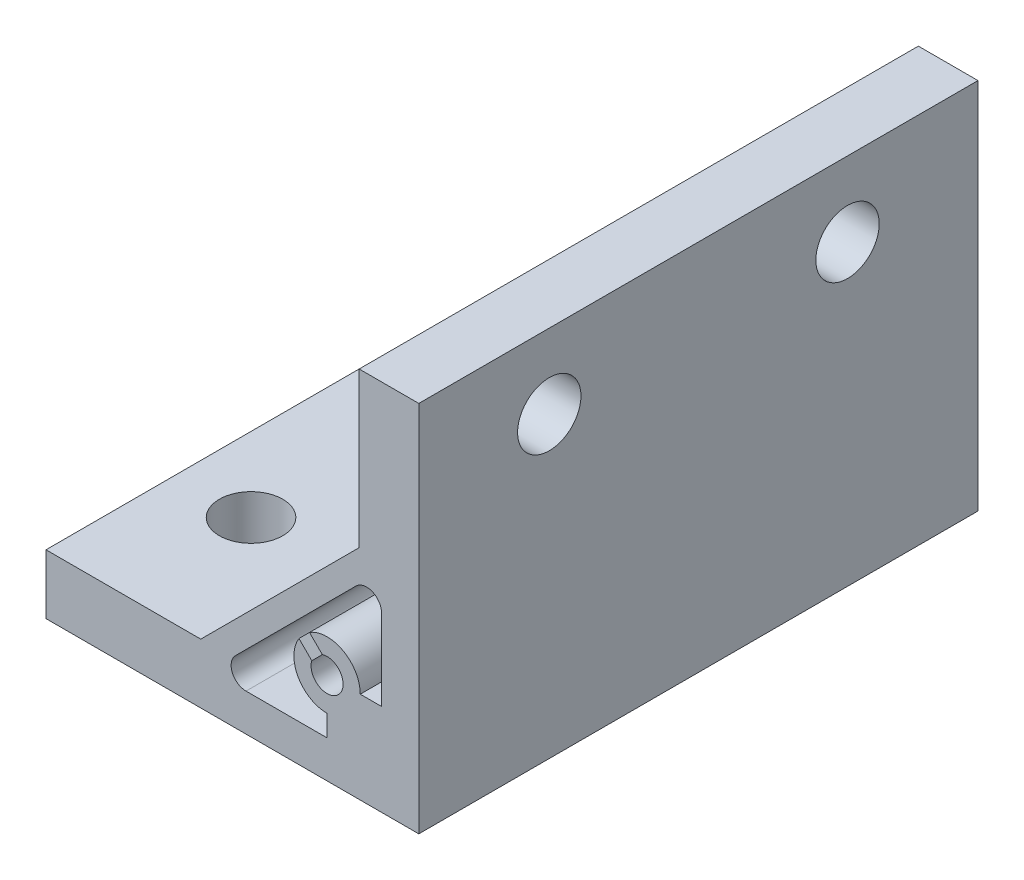
ISO-10303-21;
HEADER;
FILE_DESCRIPTION(('STEP AP214'),'2;1');
FILE_NAME('part.step','',(''),(''),'','','');
FILE_SCHEMA(('AUTOMOTIVE_DESIGN { 1 0 10303 214 1 1 1 1 }'));
ENDSEC;
DATA;
#1=APPLICATION_CONTEXT('core data for automotive mechanical design processes');
#2=APPLICATION_PROTOCOL_DEFINITION('international standard','automotive_design',2000,#1);
#3=PRODUCT_CONTEXT('',#1,'mechanical');
#4=PRODUCT('Part','Part','',(#3));
#5=PRODUCT_RELATED_PRODUCT_CATEGORY('part','',(#4));
#6=PRODUCT_DEFINITION_FORMATION('','',#4);
#7=PRODUCT_DEFINITION_CONTEXT('part definition',#1,'design');
#8=PRODUCT_DEFINITION('design','',#6,#7);
#9=PRODUCT_DEFINITION_SHAPE('','',#8);
#10=(LENGTH_UNIT() NAMED_UNIT(*) SI_UNIT(.MILLI.,.METRE.));
#11=(NAMED_UNIT(*) PLANE_ANGLE_UNIT() SI_UNIT($,.RADIAN.));
#12=(NAMED_UNIT(*) SI_UNIT($,.STERADIAN.) SOLID_ANGLE_UNIT());
#13=UNCERTAINTY_MEASURE_WITH_UNIT(LENGTH_MEASURE(1.E-05),#10,'distance_accuracy_value','');
#14=(GEOMETRIC_REPRESENTATION_CONTEXT(3) GLOBAL_UNCERTAINTY_ASSIGNED_CONTEXT((#13)) GLOBAL_UNIT_ASSIGNED_CONTEXT((#10,
#11,#12)) REPRESENTATION_CONTEXT('',''));
#15=CARTESIAN_POINT('',(0.,0.,0.));
#16=DIRECTION('',(0.,0.,1.));
#17=DIRECTION('',(1.,0.,0.));
#18=AXIS2_PLACEMENT_3D('',#15,#16,#17);
#19=CARTESIAN_POINT('',(50.,0.,37.5));
#20=DIRECTION('',(-1.,0.,0.));
#21=DIRECTION('',(0.,0.,1.));
#22=AXIS2_PLACEMENT_3D('',#19,#20,#21);
#23=PLANE('',#22);
#24=CARTESIAN_POINT('',(50.0000000000001,40.,-20.));
#25=DIRECTION('',(1.,0.,0.));
#26=DIRECTION('',(0.,0.,1.));
#27=AXIS2_PLACEMENT_3D('',#24,#25,#26);
#28=CIRCLE('',#27,4.25);
#29=CARTESIAN_POINT('',(50.0000000000001,40.,-15.75));
#30=VERTEX_POINT('',#29);
#31=EDGE_CURVE('E380',#30,#30,#28,.T.);
#32=ORIENTED_EDGE('',*,*,#31,.F.);
#33=EDGE_LOOP('',(#32));
#34=FACE_BOUND('',#33,.T.);
#35=DIRECTION('',(0.,1.,0.));
#36=VECTOR('',#35,1.);
#37=CARTESIAN_POINT('',(50.,0.,-37.5));
#38=LINE('',#37,#36);
#39=CARTESIAN_POINT('',(50.,0.,-37.5));
#40=VERTEX_POINT('',#39);
#41=CARTESIAN_POINT('',(50.,50.,-37.5));
#42=VERTEX_POINT('',#41);
#43=EDGE_CURVE('E283',#40,#42,#38,.T.);
#44=ORIENTED_EDGE('',*,*,#43,.T.);
#45=DIRECTION('',(0.,0.,-1.));
#46=VECTOR('',#45,1.);
#47=CARTESIAN_POINT('',(50.,50.,37.5));
#48=LINE('',#47,#46);
#49=CARTESIAN_POINT('',(50.,50.,37.5));
#50=VERTEX_POINT('',#49);
#51=EDGE_CURVE('E303',#50,#42,#48,.T.);
#52=ORIENTED_EDGE('',*,*,#51,.F.);
#53=DIRECTION('',(0.,1.,0.));
#54=VECTOR('',#53,1.);
#55=CARTESIAN_POINT('',(50.,0.,37.5));
#56=LINE('',#55,#54);
#57=CARTESIAN_POINT('',(50.,0.,37.5));
#58=VERTEX_POINT('',#57);
#59=EDGE_CURVE('E268',#58,#50,#56,.T.);
#60=ORIENTED_EDGE('',*,*,#59,.F.);
#61=DIRECTION('',(0.,0.,-1.));
#62=VECTOR('',#61,1.);
#63=CARTESIAN_POINT('',(50.,0.,37.5));
#64=LINE('',#63,#62);
#65=EDGE_CURVE('E43',#58,#40,#64,.T.);
#66=ORIENTED_EDGE('',*,*,#65,.T.);
#67=EDGE_LOOP('',(#44,#52,#60,#66));
#68=FACE_BOUND('',#67,.T.);
#69=CARTESIAN_POINT('',(50.0000000000001,40.,20.));
#70=DIRECTION('',(1.,0.,0.));
#71=DIRECTION('',(0.,0.,-1.));
#72=AXIS2_PLACEMENT_3D('',#69,#70,#71);
#73=CIRCLE('',#72,4.25);
#74=CARTESIAN_POINT('',(50.0000000000001,40.,15.75));
#75=VERTEX_POINT('',#74);
#76=EDGE_CURVE('E385',#75,#75,#73,.T.);
#77=ORIENTED_EDGE('',*,*,#76,.F.);
#78=EDGE_LOOP('',(#77));
#79=FACE_BOUND('',#78,.T.);
#80=ADVANCED_FACE('F35',(#34,#68,#79),#23,.F.);
#81=CARTESIAN_POINT('',(42.,29.2426406871192,37.5));
#82=DIRECTION('',(1.,0.,0.));
#83=DIRECTION('',(0.,0.,-1.));
#84=AXIS2_PLACEMENT_3D('',#81,#82,#83);
#85=PLANE('',#84);
#86=CARTESIAN_POINT('',(42.0000000000001,40.,-20.));
#87=DIRECTION('',(1.,0.,0.));
#88=DIRECTION('',(0.,0.,1.));
#89=AXIS2_PLACEMENT_3D('',#86,#87,#88);
#90=CIRCLE('',#89,4.25);
#91=CARTESIAN_POINT('',(42.0000000000001,40.,-15.75));
#92=VERTEX_POINT('',#91);
#93=EDGE_CURVE('E382',#92,#92,#90,.T.);
#94=ORIENTED_EDGE('',*,*,#93,.T.);
#95=EDGE_LOOP('',(#94));
#96=FACE_BOUND('',#95,.T.);
#97=DIRECTION('',(0.,-1.,0.));
#98=VECTOR('',#97,1.);
#99=CARTESIAN_POINT('',(42.,29.2426406871192,-37.5));
#100=LINE('',#99,#98);
#101=CARTESIAN_POINT('',(42.,50.,-37.5));
#102=VERTEX_POINT('',#101);
#103=CARTESIAN_POINT('',(42.,29.2426406871192,-37.5));
#104=VERTEX_POINT('',#103);
#105=EDGE_CURVE('E287',#102,#104,#100,.T.);
#106=ORIENTED_EDGE('',*,*,#105,.T.);
#107=DIRECTION('',(0.,0.,-1.));
#108=VECTOR('',#107,1.);
#109=CARTESIAN_POINT('',(42.,29.2426406871192,37.5));
#110=LINE('',#109,#108);
#111=CARTESIAN_POINT('',(42.,29.2426406871192,37.5));
#112=VERTEX_POINT('',#111);
#113=EDGE_CURVE('E297',#112,#104,#110,.T.);
#114=ORIENTED_EDGE('',*,*,#113,.F.);
#115=DIRECTION('',(0.,-1.,0.));
#116=VECTOR('',#115,1.);
#117=CARTESIAN_POINT('',(42.,29.2426406871192,37.5));
#118=LINE('',#117,#116);
#119=CARTESIAN_POINT('',(42.,50.,37.5));
#120=VERTEX_POINT('',#119);
#121=EDGE_CURVE('E272',#120,#112,#118,.T.);
#122=ORIENTED_EDGE('',*,*,#121,.F.);
#123=DIRECTION('',(0.,0.,-1.));
#124=VECTOR('',#123,1.);
#125=CARTESIAN_POINT('',(42.,50.,37.5));
#126=LINE('',#125,#124);
#127=EDGE_CURVE('E300',#120,#102,#126,.T.);
#128=ORIENTED_EDGE('',*,*,#127,.T.);
#129=EDGE_LOOP('',(#106,#114,#122,#128));
#130=FACE_BOUND('',#129,.T.);
#131=CARTESIAN_POINT('',(42.0000000000001,40.,20.));
#132=DIRECTION('',(1.,0.,0.));
#133=DIRECTION('',(0.,0.,-1.));
#134=AXIS2_PLACEMENT_3D('',#131,#132,#133);
#135=CIRCLE('',#134,4.25);
#136=CARTESIAN_POINT('',(42.0000000000001,40.,15.75));
#137=VERTEX_POINT('',#136);
#138=EDGE_CURVE('E388',#137,#137,#135,.T.);
#139=ORIENTED_EDGE('',*,*,#138,.T.);
#140=EDGE_LOOP('',(#139));
#141=FACE_BOUND('',#140,.T.);
#142=ADVANCED_FACE('F326',(#96,#130,#141),#85,.F.);
#143=CARTESIAN_POINT('',(0.,0.,37.5));
#144=DIRECTION('',(0.,0.,1.));
#145=DIRECTION('',(1.,0.,0.));
#146=AXIS2_PLACEMENT_3D('',#143,#144,#145);
#147=PLANE('',#146);
#148=DIRECTION('',(0.,-1.,0.));
#149=VECTOR('',#148,1.);
#150=CARTESIAN_POINT('',(0.,8.,37.5));
#151=LINE('',#150,#149);
#152=CARTESIAN_POINT('',(0.,8.,37.5));
#153=VERTEX_POINT('',#152);
#154=CARTESIAN_POINT('',(0.,0.,37.5));
#155=VERTEX_POINT('',#154);
#156=EDGE_CURVE('E262',#153,#155,#151,.T.);
#157=ORIENTED_EDGE('',*,*,#156,.T.);
#158=DIRECTION('',(1.,0.,0.));
#159=VECTOR('',#158,1.);
#160=CARTESIAN_POINT('',(0.,0.,37.5));
#161=LINE('',#160,#159);
#162=EDGE_CURVE('E265',#155,#58,#161,.T.);
#163=ORIENTED_EDGE('',*,*,#162,.T.);
#164=ORIENTED_EDGE('',*,*,#59,.T.);
#165=DIRECTION('',(-1.,0.,0.));
#166=VECTOR('',#165,1.);
#167=CARTESIAN_POINT('',(42.,50.,37.5));
#168=LINE('',#167,#166);
#169=EDGE_CURVE('E270',#50,#120,#168,.T.);
#170=ORIENTED_EDGE('',*,*,#169,.T.);
#171=ORIENTED_EDGE('',*,*,#121,.T.);
#172=DIRECTION('',(-0.707106781186546,-0.707106781186549,0.));
#173=VECTOR('',#172,1.);
#174=CARTESIAN_POINT('',(20.7573593128809,8.,37.5));
#175=LINE('',#174,#173);
#176=CARTESIAN_POINT('',(20.7573593128809,8.,37.5));
#177=VERTEX_POINT('',#176);
#178=EDGE_CURVE('E274',#112,#177,#175,.T.);
#179=ORIENTED_EDGE('',*,*,#178,.T.);
#180=DIRECTION('',(-1.,0.,0.));
#181=VECTOR('',#180,1.);
#182=CARTESIAN_POINT('',(0.,8.,37.5));
#183=LINE('',#182,#181);
#184=EDGE_CURVE('E276',#177,#153,#183,.T.);
#185=ORIENTED_EDGE('',*,*,#184,.T.);
#186=EDGE_LOOP('',(#157,#163,#164,#170,#171,#179,#185));
#187=FACE_BOUND('',#186,.T.);
#188=DIRECTION('',(0.707106781186549,-0.707106781186546,0.));
#189=VECTOR('',#188,1.);
#190=CARTESIAN_POINT('',(35.647066335444,12.9387201021829,37.5));
#191=LINE('',#190,#189);
#192=CARTESIAN_POINT('',(33.9267474297161,14.6590390079109,37.5));
#193=VERTEX_POINT('',#192);
#194=CARTESIAN_POINT('',(35.647066335444,12.9387201021829,37.5));
#195=VERTEX_POINT('',#194);
#196=EDGE_CURVE('E174',#193,#195,#191,.T.);
#197=ORIENTED_EDGE('',*,*,#196,.F.);
#198=CARTESIAN_POINT('',(37.7,12.3,37.5));
#199=DIRECTION('',(0.,0.,-1.));
#200=DIRECTION('',(1.,0.,0.));
#201=AXIS2_PLACEMENT_3D('',#198,#199,#200);
#202=CIRCLE('',#201,4.45);
#203=CARTESIAN_POINT('',(37.7,7.84999999999995,37.5));
#204=VERTEX_POINT('',#203);
#205=EDGE_CURVE('E166',#204,#193,#202,.T.);
#206=ORIENTED_EDGE('',*,*,#205,.F.);
#207=DIRECTION('',(0.,1.,0.));
#208=VECTOR('',#207,1.);
#209=CARTESIAN_POINT('',(37.7,5.,37.5));
#210=LINE('',#209,#208);
#211=CARTESIAN_POINT('',(37.7,5.,37.5));
#212=VERTEX_POINT('',#211);
#213=EDGE_CURVE('E209',#212,#204,#210,.T.);
#214=ORIENTED_EDGE('',*,*,#213,.F.);
#215=DIRECTION('',(1.,0.,0.));
#216=VECTOR('',#215,1.);
#217=CARTESIAN_POINT('',(26.828427124746,5.,37.5));
#218=LINE('',#217,#216);
#219=CARTESIAN_POINT('',(26.828427124746,4.99999999999993,37.5));
#220=VERTEX_POINT('',#219);
#221=EDGE_CURVE('E207',#220,#212,#218,.T.);
#222=ORIENTED_EDGE('',*,*,#221,.F.);
#223=CARTESIAN_POINT('',(26.8284271247464,7.00000000000011,37.5));
#224=DIRECTION('',(0.,0.,1.));
#225=DIRECTION('',(1.,0.,0.));
#226=AXIS2_PLACEMENT_3D('',#223,#224,#225);
#227=CIRCLE('',#226,2.00000000000019);
#228=CARTESIAN_POINT('',(25.4142135623729,8.41421356237311,37.5));
#229=VERTEX_POINT('',#228);
#230=EDGE_CURVE('E205',#229,#220,#227,.T.);
#231=ORIENTED_EDGE('',*,*,#230,.F.);
#232=DIRECTION('',(-0.70710678118655,-0.707106781186545,0.));
#233=VECTOR('',#232,1.);
#234=CARTESIAN_POINT('',(25.4142135623729,8.41421356237311,37.5));
#235=LINE('',#234,#233);
#236=CARTESIAN_POINT('',(41.585786437627,24.5857864376269,37.5));
#237=VERTEX_POINT('',#236);
#238=EDGE_CURVE('E203',#237,#229,#235,.T.);
#239=ORIENTED_EDGE('',*,*,#238,.F.);
#240=CARTESIAN_POINT('',(43.0000000000002,23.171572875254,37.5));
#241=DIRECTION('',(0.,0.,1.));
#242=DIRECTION('',(1.,0.,0.));
#243=AXIS2_PLACEMENT_3D('',#240,#241,#242);
#244=CIRCLE('',#243,1.99999999999993);
#245=CARTESIAN_POINT('',(45.,23.1715728752539,37.5));
#246=VERTEX_POINT('',#245);
#247=EDGE_CURVE('E201',#246,#237,#244,.T.);
#248=ORIENTED_EDGE('',*,*,#247,.F.);
#249=DIRECTION('',(0.,1.,0.));
#250=VECTOR('',#249,1.);
#251=CARTESIAN_POINT('',(45.,23.1715728752539,37.5));
#252=LINE('',#251,#250);
#253=CARTESIAN_POINT('',(45.,12.3,37.5));
#254=VERTEX_POINT('',#253);
#255=EDGE_CURVE('E199',#254,#246,#252,.T.);
#256=ORIENTED_EDGE('',*,*,#255,.F.);
#257=DIRECTION('',(1.,0.,0.));
#258=VECTOR('',#257,1.);
#259=CARTESIAN_POINT('',(42.15,12.3,37.5));
#260=LINE('',#259,#258);
#261=CARTESIAN_POINT('',(42.15,12.3,37.5));
#262=VERTEX_POINT('',#261);
#263=EDGE_CURVE('E197',#262,#254,#260,.T.);
#264=ORIENTED_EDGE('',*,*,#263,.F.);
#265=CARTESIAN_POINT('',(37.7,12.3,37.5));
#266=DIRECTION('',(0.,0.,-1.));
#267=DIRECTION('',(1.,0.,0.));
#268=AXIS2_PLACEMENT_3D('',#265,#266,#267);
#269=CIRCLE('',#268,4.45);
#270=CARTESIAN_POINT('',(35.3409609920885,16.0732525702836,37.5));
#271=VERTEX_POINT('',#270);
#272=EDGE_CURVE('E195',#271,#262,#269,.T.);
#273=ORIENTED_EDGE('',*,*,#272,.F.);
#274=DIRECTION('',(-0.707106781186684,0.707106781186411,0.));
#275=VECTOR('',#274,1.);
#276=CARTESIAN_POINT('',(37.0612798978168,14.3529336645559,37.5));
#277=LINE('',#276,#275);
#278=CARTESIAN_POINT('',(37.0612798978168,14.3529336645559,37.5));
#279=VERTEX_POINT('',#278);
#280=EDGE_CURVE('E190',#279,#271,#277,.T.);
#281=ORIENTED_EDGE('',*,*,#280,.F.);
#282=CARTESIAN_POINT('',(37.7,12.3,37.5));
#283=DIRECTION('',(0.,0.,1.));
#284=DIRECTION('',(1.,0.,0.));
#285=AXIS2_PLACEMENT_3D('',#282,#283,#284);
#286=CIRCLE('',#285,2.15);
#287=EDGE_CURVE('E188',#195,#279,#286,.T.);
#288=ORIENTED_EDGE('',*,*,#287,.F.);
#289=EDGE_LOOP('',(#197,#206,#214,#222,#231,#239,#248,#256,#264,#273,#281,#288));
#290=FACE_BOUND('',#289,.T.);
#291=ADVANCED_FACE('F186',(#187,#290),#147,.T.);
#292=CARTESIAN_POINT('',(0.,0.,-37.5));
#293=DIRECTION('',(0.,0.,1.));
#294=DIRECTION('',(1.,0.,0.));
#295=AXIS2_PLACEMENT_3D('',#292,#293,#294);
#296=PLANE('',#295);
#297=DIRECTION('',(0.,-1.,0.));
#298=VECTOR('',#297,1.);
#299=CARTESIAN_POINT('',(0.,8.,-37.5));
#300=LINE('',#299,#298);
#301=CARTESIAN_POINT('',(0.,8.,-37.5));
#302=VERTEX_POINT('',#301);
#303=CARTESIAN_POINT('',(0.,0.,-37.5));
#304=VERTEX_POINT('',#303);
#305=EDGE_CURVE('E182',#302,#304,#300,.T.);
#306=ORIENTED_EDGE('',*,*,#305,.F.);
#307=DIRECTION('',(-1.,0.,0.));
#308=VECTOR('',#307,1.);
#309=CARTESIAN_POINT('',(0.,8.,-37.5));
#310=LINE('',#309,#308);
#311=CARTESIAN_POINT('',(20.7573593128809,8.,-37.5));
#312=VERTEX_POINT('',#311);
#313=EDGE_CURVE('E266',#312,#302,#310,.T.);
#314=ORIENTED_EDGE('',*,*,#313,.F.);
#315=DIRECTION('',(-0.707106781186546,-0.707106781186549,0.));
#316=VECTOR('',#315,1.);
#317=CARTESIAN_POINT('',(20.7573593128809,8.,-37.5));
#318=LINE('',#317,#316);
#319=EDGE_CURVE('E289',#104,#312,#318,.T.);
#320=ORIENTED_EDGE('',*,*,#319,.F.);
#321=ORIENTED_EDGE('',*,*,#105,.F.);
#322=DIRECTION('',(-1.,0.,0.));
#323=VECTOR('',#322,1.);
#324=CARTESIAN_POINT('',(42.,50.,-37.5));
#325=LINE('',#324,#323);
#326=EDGE_CURVE('E285',#42,#102,#325,.T.);
#327=ORIENTED_EDGE('',*,*,#326,.F.);
#328=ORIENTED_EDGE('',*,*,#43,.F.);
#329=DIRECTION('',(1.,0.,0.));
#330=VECTOR('',#329,1.);
#331=CARTESIAN_POINT('',(0.,0.,-37.5));
#332=LINE('',#331,#330);
#333=EDGE_CURVE('E281',#304,#40,#332,.T.);
#334=ORIENTED_EDGE('',*,*,#333,.F.);
#335=EDGE_LOOP('',(#306,#314,#320,#321,#327,#328,#334));
#336=FACE_BOUND('',#335,.T.);
#337=CARTESIAN_POINT('',(37.7,12.3,-37.5));
#338=DIRECTION('',(0.,0.,-1.));
#339=DIRECTION('',(1.,0.,0.));
#340=AXIS2_PLACEMENT_3D('',#337,#338,#339);
#341=CIRCLE('',#340,4.45);
#342=CARTESIAN_POINT('',(37.7,7.84999999999995,-37.5));
#343=VERTEX_POINT('',#342);
#344=CARTESIAN_POINT('',(33.9267474297161,14.6590390079109,-37.5));
#345=VERTEX_POINT('',#344);
#346=EDGE_CURVE('E58',#343,#345,#341,.T.);
#347=ORIENTED_EDGE('',*,*,#346,.T.);
#348=DIRECTION('',(0.707106781186549,-0.707106781186546,0.));
#349=VECTOR('',#348,1.);
#350=CARTESIAN_POINT('',(35.647066335444,12.9387201021829,-37.5));
#351=LINE('',#350,#349);
#352=CARTESIAN_POINT('',(35.647066335444,12.9387201021829,-37.5));
#353=VERTEX_POINT('',#352);
#354=EDGE_CURVE('E181',#345,#353,#351,.T.);
#355=ORIENTED_EDGE('',*,*,#354,.T.);
#356=CARTESIAN_POINT('',(37.7,12.3,-37.5));
#357=DIRECTION('',(0.,0.,1.));
#358=DIRECTION('',(1.,0.,0.));
#359=AXIS2_PLACEMENT_3D('',#356,#357,#358);
#360=CIRCLE('',#359,2.15);
#361=CARTESIAN_POINT('',(37.0612798978168,14.3529336645559,-37.5));
#362=VERTEX_POINT('',#361);
#363=EDGE_CURVE('E214',#353,#362,#360,.T.);
#364=ORIENTED_EDGE('',*,*,#363,.T.);
#365=DIRECTION('',(-0.707106781186684,0.707106781186411,0.));
#366=VECTOR('',#365,1.);
#367=CARTESIAN_POINT('',(37.0612798978168,14.3529336645559,-37.5));
#368=LINE('',#367,#366);
#369=CARTESIAN_POINT('',(35.3409609920885,16.0732525702836,-37.5));
#370=VERTEX_POINT('',#369);
#371=EDGE_CURVE('E217',#362,#370,#368,.T.);
#372=ORIENTED_EDGE('',*,*,#371,.T.);
#373=CARTESIAN_POINT('',(37.7,12.3,-37.5));
#374=DIRECTION('',(0.,0.,-1.));
#375=DIRECTION('',(1.,0.,0.));
#376=AXIS2_PLACEMENT_3D('',#373,#374,#375);
#377=CIRCLE('',#376,4.45);
#378=CARTESIAN_POINT('',(42.15,12.3,-37.5));
#379=VERTEX_POINT('',#378);
#380=EDGE_CURVE('E220',#370,#379,#377,.T.);
#381=ORIENTED_EDGE('',*,*,#380,.T.);
#382=DIRECTION('',(1.,0.,0.));
#383=VECTOR('',#382,1.);
#384=CARTESIAN_POINT('',(42.15,12.3,-37.5));
#385=LINE('',#384,#383);
#386=CARTESIAN_POINT('',(45.,12.3,-37.5));
#387=VERTEX_POINT('',#386);
#388=EDGE_CURVE('E223',#379,#387,#385,.T.);
#389=ORIENTED_EDGE('',*,*,#388,.T.);
#390=DIRECTION('',(0.,1.,0.));
#391=VECTOR('',#390,1.);
#392=CARTESIAN_POINT('',(45.,23.1715728752539,-37.5));
#393=LINE('',#392,#391);
#394=CARTESIAN_POINT('',(45.,23.1715728752539,-37.5));
#395=VERTEX_POINT('',#394);
#396=EDGE_CURVE('E226',#387,#395,#393,.T.);
#397=ORIENTED_EDGE('',*,*,#396,.T.);
#398=CARTESIAN_POINT('',(43.0000000000002,23.171572875254,-37.5));
#399=DIRECTION('',(0.,0.,1.));
#400=DIRECTION('',(1.,0.,0.));
#401=AXIS2_PLACEMENT_3D('',#398,#399,#400);
#402=CIRCLE('',#401,1.99999999999993);
#403=CARTESIAN_POINT('',(41.585786437627,24.5857864376269,-37.5));
#404=VERTEX_POINT('',#403);
#405=EDGE_CURVE('E229',#395,#404,#402,.T.);
#406=ORIENTED_EDGE('',*,*,#405,.T.);
#407=DIRECTION('',(-0.70710678118655,-0.707106781186545,0.));
#408=VECTOR('',#407,1.);
#409=CARTESIAN_POINT('',(25.4142135623729,8.41421356237311,-37.5));
#410=LINE('',#409,#408);
#411=CARTESIAN_POINT('',(25.4142135623729,8.41421356237311,-37.5));
#412=VERTEX_POINT('',#411);
#413=EDGE_CURVE('E232',#404,#412,#410,.T.);
#414=ORIENTED_EDGE('',*,*,#413,.T.);
#415=CARTESIAN_POINT('',(26.8284271247464,7.00000000000011,-37.5));
#416=DIRECTION('',(0.,0.,1.));
#417=DIRECTION('',(1.,0.,0.));
#418=AXIS2_PLACEMENT_3D('',#415,#416,#417);
#419=CIRCLE('',#418,2.00000000000019);
#420=CARTESIAN_POINT('',(26.828427124746,4.99999999999993,-37.5));
#421=VERTEX_POINT('',#420);
#422=EDGE_CURVE('E235',#412,#421,#419,.T.);
#423=ORIENTED_EDGE('',*,*,#422,.T.);
#424=DIRECTION('',(1.,0.,0.));
#425=VECTOR('',#424,1.);
#426=CARTESIAN_POINT('',(26.828427124746,5.,-37.5));
#427=LINE('',#426,#425);
#428=CARTESIAN_POINT('',(37.7,5.,-37.5));
#429=VERTEX_POINT('',#428);
#430=EDGE_CURVE('E238',#421,#429,#427,.T.);
#431=ORIENTED_EDGE('',*,*,#430,.T.);
#432=DIRECTION('',(0.,1.,0.));
#433=VECTOR('',#432,1.);
#434=CARTESIAN_POINT('',(37.7,5.,-37.5));
#435=LINE('',#434,#433);
#436=EDGE_CURVE('E175',#429,#343,#435,.T.);
#437=ORIENTED_EDGE('',*,*,#436,.T.);
#438=EDGE_LOOP('',(#347,#355,#364,#372,#381,#389,#397,#406,#414,#423,#431,#437));
#439=FACE_BOUND('',#438,.T.);
#440=ADVANCED_FACE('F316',(#336,#439),#296,.F.);
#441=CARTESIAN_POINT('',(0.,8.,37.5));
#442=DIRECTION('',(1.,0.,0.));
#443=DIRECTION('',(0.,0.,-1.));
#444=AXIS2_PLACEMENT_3D('',#441,#442,#443);
#445=PLANE('',#444);
#446=ORIENTED_EDGE('',*,*,#305,.T.);
#447=DIRECTION('',(0.,0.,-1.));
#448=VECTOR('',#447,1.);
#449=CARTESIAN_POINT('',(0.,0.,37.5));
#450=LINE('',#449,#448);
#451=EDGE_CURVE('E11',#155,#304,#450,.T.);
#452=ORIENTED_EDGE('',*,*,#451,.F.);
#453=ORIENTED_EDGE('',*,*,#156,.F.);
#454=DIRECTION('',(0.,0.,-1.));
#455=VECTOR('',#454,1.);
#456=CARTESIAN_POINT('',(0.,8.,37.5));
#457=LINE('',#456,#455);
#458=EDGE_CURVE('E278',#153,#302,#457,.T.);
#459=ORIENTED_EDGE('',*,*,#458,.T.);
#460=EDGE_LOOP('',(#446,#452,#453,#459));
#461=FACE_BOUND('',#460,.T.);
#462=ADVANCED_FACE('F37',(#461),#445,.F.);
#463=CARTESIAN_POINT('',(0.,0.,37.5));
#464=DIRECTION('',(0.,1.,0.));
#465=DIRECTION('',(0.,0.,1.));
#466=AXIS2_PLACEMENT_3D('',#463,#464,#465);
#467=PLANE('',#466);
#468=CARTESIAN_POINT('',(10.,0.,20.));
#469=DIRECTION('',(0.,1.,0.));
#470=DIRECTION('',(0.,0.,-1.));
#471=AXIS2_PLACEMENT_3D('',#468,#469,#470);
#472=CIRCLE('',#471,4.25);
#473=CARTESIAN_POINT('',(10.,0.,15.75));
#474=VERTEX_POINT('',#473);
#475=EDGE_CURVE('E369',#474,#474,#472,.T.);
#476=ORIENTED_EDGE('',*,*,#475,.T.);
#477=EDGE_LOOP('',(#476));
#478=FACE_BOUND('',#477,.T.);
#479=CARTESIAN_POINT('',(10.,0.,-20.));
#480=DIRECTION('',(0.,1.,0.));
#481=DIRECTION('',(0.,0.,1.));
#482=AXIS2_PLACEMENT_3D('',#479,#480,#481);
#483=CIRCLE('',#482,4.25);
#484=CARTESIAN_POINT('',(10.,0.,-15.75));
#485=VERTEX_POINT('',#484);
#486=EDGE_CURVE('E212',#485,#485,#483,.T.);
#487=ORIENTED_EDGE('',*,*,#486,.T.);
#488=EDGE_LOOP('',(#487));
#489=FACE_BOUND('',#488,.T.);
#490=ORIENTED_EDGE('',*,*,#333,.T.);
#491=ORIENTED_EDGE('',*,*,#65,.F.);
#492=ORIENTED_EDGE('',*,*,#162,.F.);
#493=ORIENTED_EDGE('',*,*,#451,.T.);
#494=EDGE_LOOP('',(#490,#491,#492,#493));
#495=FACE_BOUND('',#494,.T.);
#496=ADVANCED_FACE('F334',(#478,#489,#495),#467,.F.);
#497=CARTESIAN_POINT('',(42.,50.,37.5));
#498=DIRECTION('',(0.,-1.,0.));
#499=DIRECTION('',(0.,0.,-1.));
#500=AXIS2_PLACEMENT_3D('',#497,#498,#499);
#501=PLANE('',#500);
#502=ORIENTED_EDGE('',*,*,#326,.T.);
#503=ORIENTED_EDGE('',*,*,#127,.F.);
#504=ORIENTED_EDGE('',*,*,#169,.F.);
#505=ORIENTED_EDGE('',*,*,#51,.T.);
#506=EDGE_LOOP('',(#502,#503,#504,#505));
#507=FACE_BOUND('',#506,.T.);
#508=ADVANCED_FACE('F322',(#507),#501,.F.);
#509=CARTESIAN_POINT('',(20.7573593128809,8.,37.5));
#510=DIRECTION('',(0.707106781186549,-0.707106781186546,0.));
#511=DIRECTION('',(0.707106781186546,0.707106781186549,0.));
#512=AXIS2_PLACEMENT_3D('',#509,#510,#511);
#513=PLANE('',#512);
#514=ORIENTED_EDGE('',*,*,#319,.T.);
#515=DIRECTION('',(0.,0.,-1.));
#516=VECTOR('',#515,1.);
#517=CARTESIAN_POINT('',(20.7573593128809,8.,37.5));
#518=LINE('',#517,#516);
#519=EDGE_CURVE('E294',#177,#312,#518,.T.);
#520=ORIENTED_EDGE('',*,*,#519,.F.);
#521=ORIENTED_EDGE('',*,*,#178,.F.);
#522=ORIENTED_EDGE('',*,*,#113,.T.);
#523=EDGE_LOOP('',(#514,#520,#521,#522));
#524=FACE_BOUND('',#523,.T.);
#525=ADVANCED_FACE('F342',(#524),#513,.F.);
#526=CARTESIAN_POINT('',(0.,8.,37.5));
#527=DIRECTION('',(0.,-1.,0.));
#528=DIRECTION('',(0.,0.,-1.));
#529=AXIS2_PLACEMENT_3D('',#526,#527,#528);
#530=PLANE('',#529);
#531=CARTESIAN_POINT('',(10.,8.,20.));
#532=DIRECTION('',(0.,1.,0.));
#533=DIRECTION('',(0.,0.,-1.));
#534=AXIS2_PLACEMENT_3D('',#531,#532,#533);
#535=CIRCLE('',#534,4.25);
#536=CARTESIAN_POINT('',(10.,8.,15.75));
#537=VERTEX_POINT('',#536);
#538=EDGE_CURVE('E377',#537,#537,#535,.T.);
#539=ORIENTED_EDGE('',*,*,#538,.F.);
#540=EDGE_LOOP('',(#539));
#541=FACE_BOUND('',#540,.T.);
#542=CARTESIAN_POINT('',(10.,8.,-20.));
#543=DIRECTION('',(0.,1.,0.));
#544=DIRECTION('',(0.,0.,1.));
#545=AXIS2_PLACEMENT_3D('',#542,#543,#544);
#546=CIRCLE('',#545,4.25);
#547=CARTESIAN_POINT('',(10.,8.,-15.75));
#548=VERTEX_POINT('',#547);
#549=EDGE_CURVE('E373',#548,#548,#546,.T.);
#550=ORIENTED_EDGE('',*,*,#549,.F.);
#551=EDGE_LOOP('',(#550));
#552=FACE_BOUND('',#551,.T.);
#553=ORIENTED_EDGE('',*,*,#313,.T.);
#554=ORIENTED_EDGE('',*,*,#458,.F.);
#555=ORIENTED_EDGE('',*,*,#184,.F.);
#556=ORIENTED_EDGE('',*,*,#519,.T.);
#557=EDGE_LOOP('',(#553,#554,#555,#556));
#558=FACE_BOUND('',#557,.T.);
#559=ADVANCED_FACE('F339',(#541,#552,#558),#530,.F.);
#560=CARTESIAN_POINT('',(37.7,12.3,37.5));
#561=DIRECTION('',(0.,0.,-1.));
#562=DIRECTION('',(-1.,0.,0.));
#563=AXIS2_PLACEMENT_3D('',#560,#561,#562);
#564=CYLINDRICAL_SURFACE('',#563,4.45);
#565=ORIENTED_EDGE('',*,*,#346,.F.);
#566=DIRECTION('',(0.,0.,-1.));
#567=VECTOR('',#566,1.);
#568=CARTESIAN_POINT('',(37.7,7.84999999999995,37.5));
#569=LINE('',#568,#567);
#570=EDGE_CURVE('E170',#204,#343,#569,.T.);
#571=ORIENTED_EDGE('',*,*,#570,.F.);
#572=ORIENTED_EDGE('',*,*,#205,.T.);
#573=DIRECTION('',(0.,0.,-1.));
#574=VECTOR('',#573,1.);
#575=CARTESIAN_POINT('',(33.9267474297161,14.6590390079109,37.5));
#576=LINE('',#575,#574);
#577=EDGE_CURVE('E169',#193,#345,#576,.T.);
#578=ORIENTED_EDGE('',*,*,#577,.T.);
#579=EDGE_LOOP('',(#565,#571,#572,#578));
#580=FACE_BOUND('',#579,.T.);
#581=ADVANCED_FACE('F168',(#580),#564,.T.);
#582=CARTESIAN_POINT('',(35.647066335444,12.9387201021829,37.5));
#583=DIRECTION('',(0.707106781186546,0.707106781186549,0.));
#584=DIRECTION('',(-0.707106781186549,0.707106781186546,0.));
#585=AXIS2_PLACEMENT_3D('',#582,#583,#584);
#586=PLANE('',#585);
#587=ORIENTED_EDGE('',*,*,#354,.F.);
#588=ORIENTED_EDGE('',*,*,#577,.F.);
#589=ORIENTED_EDGE('',*,*,#196,.T.);
#590=DIRECTION('',(0.,0.,-1.));
#591=VECTOR('',#590,1.);
#592=CARTESIAN_POINT('',(35.647066335444,12.9387201021829,37.5));
#593=LINE('',#592,#591);
#594=EDGE_CURVE('E183',#195,#353,#593,.T.);
#595=ORIENTED_EDGE('',*,*,#594,.T.);
#596=EDGE_LOOP('',(#587,#588,#589,#595));
#597=FACE_BOUND('',#596,.T.);
#598=ADVANCED_FACE('F178',(#597),#586,.T.);
#599=CARTESIAN_POINT('',(37.7,12.3,37.5));
#600=DIRECTION('',(0.,0.,-1.));
#601=DIRECTION('',(-1.,0.,0.));
#602=AXIS2_PLACEMENT_3D('',#599,#600,#601);
#603=CYLINDRICAL_SURFACE('',#602,2.15);
#604=ORIENTED_EDGE('',*,*,#363,.F.);
#605=ORIENTED_EDGE('',*,*,#594,.F.);
#606=ORIENTED_EDGE('',*,*,#287,.T.);
#607=DIRECTION('',(0.,0.,-1.));
#608=VECTOR('',#607,1.);
#609=CARTESIAN_POINT('',(37.0612798978168,14.3529336645559,37.5));
#610=LINE('',#609,#608);
#611=EDGE_CURVE('E259',#279,#362,#610,.T.);
#612=ORIENTED_EDGE('',*,*,#611,.T.);
#613=EDGE_LOOP('',(#604,#605,#606,#612));
#614=FACE_BOUND('',#613,.T.);
#615=ADVANCED_FACE('F447',(#614),#603,.F.);
#616=CARTESIAN_POINT('',(37.0612798978168,14.3529336645559,37.5));
#617=DIRECTION('',(-0.707106781186411,-0.707106781186684,0.));
#618=DIRECTION('',(0.707106781186684,-0.707106781186411,0.));
#619=AXIS2_PLACEMENT_3D('',#616,#617,#618);
#620=PLANE('',#619);
#621=ORIENTED_EDGE('',*,*,#371,.F.);
#622=ORIENTED_EDGE('',*,*,#611,.F.);
#623=ORIENTED_EDGE('',*,*,#280,.T.);
#624=DIRECTION('',(0.,0.,-1.));
#625=VECTOR('',#624,1.);
#626=CARTESIAN_POINT('',(35.3409609920885,16.0732525702836,37.5));
#627=LINE('',#626,#625);
#628=EDGE_CURVE('E257',#271,#370,#627,.T.);
#629=ORIENTED_EDGE('',*,*,#628,.T.);
#630=EDGE_LOOP('',(#621,#622,#623,#629));
#631=FACE_BOUND('',#630,.T.);
#632=ADVANCED_FACE('F443',(#631),#620,.T.);
#633=CARTESIAN_POINT('',(37.7,12.3,37.5));
#634=DIRECTION('',(0.,0.,-1.));
#635=DIRECTION('',(-1.,0.,0.));
#636=AXIS2_PLACEMENT_3D('',#633,#634,#635);
#637=CYLINDRICAL_SURFACE('',#636,4.45);
#638=ORIENTED_EDGE('',*,*,#380,.F.);
#639=ORIENTED_EDGE('',*,*,#628,.F.);
#640=ORIENTED_EDGE('',*,*,#272,.T.);
#641=DIRECTION('',(0.,0.,-1.));
#642=VECTOR('',#641,1.);
#643=CARTESIAN_POINT('',(42.15,12.3,37.5));
#644=LINE('',#643,#642);
#645=EDGE_CURVE('E255',#262,#379,#644,.T.);
#646=ORIENTED_EDGE('',*,*,#645,.T.);
#647=EDGE_LOOP('',(#638,#639,#640,#646));
#648=FACE_BOUND('',#647,.T.);
#649=ADVANCED_FACE('F439',(#648),#637,.T.);
#650=CARTESIAN_POINT('',(42.15,12.3,37.5));
#651=DIRECTION('',(0.,1.,0.));
#652=DIRECTION('',(0.,0.,1.));
#653=AXIS2_PLACEMENT_3D('',#650,#651,#652);
#654=PLANE('',#653);
#655=ORIENTED_EDGE('',*,*,#388,.F.);
#656=ORIENTED_EDGE('',*,*,#645,.F.);
#657=ORIENTED_EDGE('',*,*,#263,.T.);
#658=DIRECTION('',(0.,0.,-1.));
#659=VECTOR('',#658,1.);
#660=CARTESIAN_POINT('',(45.,12.3,37.5));
#661=LINE('',#660,#659);
#662=EDGE_CURVE('E253',#254,#387,#661,.T.);
#663=ORIENTED_EDGE('',*,*,#662,.T.);
#664=EDGE_LOOP('',(#655,#656,#657,#663));
#665=FACE_BOUND('',#664,.T.);
#666=ADVANCED_FACE('F435',(#665),#654,.T.);
#667=CARTESIAN_POINT('',(45.,23.1715728752539,37.5));
#668=DIRECTION('',(-1.,0.,0.));
#669=DIRECTION('',(0.,0.,1.));
#670=AXIS2_PLACEMENT_3D('',#667,#668,#669);
#671=PLANE('',#670);
#672=ORIENTED_EDGE('',*,*,#396,.F.);
#673=ORIENTED_EDGE('',*,*,#662,.F.);
#674=ORIENTED_EDGE('',*,*,#255,.T.);
#675=DIRECTION('',(0.,0.,-1.));
#676=VECTOR('',#675,1.);
#677=CARTESIAN_POINT('',(45.,23.1715728752539,37.5));
#678=LINE('',#677,#676);
#679=EDGE_CURVE('E251',#246,#395,#678,.T.);
#680=ORIENTED_EDGE('',*,*,#679,.T.);
#681=EDGE_LOOP('',(#672,#673,#674,#680));
#682=FACE_BOUND('',#681,.T.);
#683=ADVANCED_FACE('F431',(#682),#671,.T.);
#684=CARTESIAN_POINT('',(43.0000000000002,23.171572875254,37.5));
#685=DIRECTION('',(0.,0.,-1.));
#686=DIRECTION('',(-1.,0.,0.));
#687=AXIS2_PLACEMENT_3D('',#684,#685,#686);
#688=CYLINDRICAL_SURFACE('',#687,1.99999999999993);
#689=ORIENTED_EDGE('',*,*,#405,.F.);
#690=ORIENTED_EDGE('',*,*,#679,.F.);
#691=ORIENTED_EDGE('',*,*,#247,.T.);
#692=DIRECTION('',(0.,0.,-1.));
#693=VECTOR('',#692,1.);
#694=CARTESIAN_POINT('',(41.585786437627,24.5857864376269,37.5));
#695=LINE('',#694,#693);
#696=EDGE_CURVE('E249',#237,#404,#695,.T.);
#697=ORIENTED_EDGE('',*,*,#696,.T.);
#698=EDGE_LOOP('',(#689,#690,#691,#697));
#699=FACE_BOUND('',#698,.T.);
#700=ADVANCED_FACE('F427',(#699),#688,.F.);
#701=CARTESIAN_POINT('',(25.4142135623729,8.41421356237311,37.5));
#702=DIRECTION('',(0.707106781186545,-0.70710678118655,0.));
#703=DIRECTION('',(0.70710678118655,0.707106781186545,0.));
#704=AXIS2_PLACEMENT_3D('',#701,#702,#703);
#705=PLANE('',#704);
#706=ORIENTED_EDGE('',*,*,#413,.F.);
#707=ORIENTED_EDGE('',*,*,#696,.F.);
#708=ORIENTED_EDGE('',*,*,#238,.T.);
#709=DIRECTION('',(0.,0.,-1.));
#710=VECTOR('',#709,1.);
#711=CARTESIAN_POINT('',(25.4142135623729,8.41421356237311,37.5));
#712=LINE('',#711,#710);
#713=EDGE_CURVE('E247',#229,#412,#712,.T.);
#714=ORIENTED_EDGE('',*,*,#713,.T.);
#715=EDGE_LOOP('',(#706,#707,#708,#714));
#716=FACE_BOUND('',#715,.T.);
#717=ADVANCED_FACE('F423',(#716),#705,.T.);
#718=CARTESIAN_POINT('',(26.8284271247464,7.00000000000011,37.5));
#719=DIRECTION('',(0.,0.,-1.));
#720=DIRECTION('',(-1.,0.,0.));
#721=AXIS2_PLACEMENT_3D('',#718,#719,#720);
#722=CYLINDRICAL_SURFACE('',#721,2.00000000000019);
#723=ORIENTED_EDGE('',*,*,#422,.F.);
#724=ORIENTED_EDGE('',*,*,#713,.F.);
#725=ORIENTED_EDGE('',*,*,#230,.T.);
#726=DIRECTION('',(0.,0.,-1.));
#727=VECTOR('',#726,1.);
#728=CARTESIAN_POINT('',(26.828427124746,4.99999999999993,37.5));
#729=LINE('',#728,#727);
#730=EDGE_CURVE('E245',#220,#421,#729,.T.);
#731=ORIENTED_EDGE('',*,*,#730,.T.);
#732=EDGE_LOOP('',(#723,#724,#725,#731));
#733=FACE_BOUND('',#732,.T.);
#734=ADVANCED_FACE('F419',(#733),#722,.F.);
#735=CARTESIAN_POINT('',(26.828427124746,5.,37.5));
#736=DIRECTION('',(0.,1.,0.));
#737=DIRECTION('',(0.,0.,1.));
#738=AXIS2_PLACEMENT_3D('',#735,#736,#737);
#739=PLANE('',#738);
#740=ORIENTED_EDGE('',*,*,#430,.F.);
#741=ORIENTED_EDGE('',*,*,#730,.F.);
#742=ORIENTED_EDGE('',*,*,#221,.T.);
#743=DIRECTION('',(0.,0.,-1.));
#744=VECTOR('',#743,1.);
#745=CARTESIAN_POINT('',(37.7,5.,37.5));
#746=LINE('',#745,#744);
#747=EDGE_CURVE('E50',#212,#429,#746,.T.);
#748=ORIENTED_EDGE('',*,*,#747,.T.);
#749=EDGE_LOOP('',(#740,#741,#742,#748));
#750=FACE_BOUND('',#749,.T.);
#751=ADVANCED_FACE('F416',(#750),#739,.T.);
#752=CARTESIAN_POINT('',(37.7,5.,37.5));
#753=DIRECTION('',(-1.,0.,0.));
#754=DIRECTION('',(0.,0.,1.));
#755=AXIS2_PLACEMENT_3D('',#752,#753,#754);
#756=PLANE('',#755);
#757=ORIENTED_EDGE('',*,*,#436,.F.);
#758=ORIENTED_EDGE('',*,*,#747,.F.);
#759=ORIENTED_EDGE('',*,*,#213,.T.);
#760=ORIENTED_EDGE('',*,*,#570,.T.);
#761=EDGE_LOOP('',(#757,#758,#759,#760));
#762=FACE_BOUND('',#761,.T.);
#763=ADVANCED_FACE('F413',(#762),#756,.T.);
#764=CARTESIAN_POINT('',(10.,0.,-20.));
#765=DIRECTION('',(0.,1.,0.));
#766=DIRECTION('',(0.,0.,1.));
#767=AXIS2_PLACEMENT_3D('',#764,#765,#766);
#768=CYLINDRICAL_SURFACE('',#767,4.25);
#769=ORIENTED_EDGE('',*,*,#486,.F.);
#770=EDGE_LOOP('',(#769));
#771=FACE_BOUND('',#770,.T.);
#772=ORIENTED_EDGE('',*,*,#549,.T.);
#773=EDGE_LOOP('',(#772));
#774=FACE_BOUND('',#773,.T.);
#775=ADVANCED_FACE('F409',(#771,#774),#768,.F.);
#776=CARTESIAN_POINT('',(10.,0.,20.));
#777=DIRECTION('',(0.,1.,0.));
#778=DIRECTION('',(0.,0.,1.));
#779=AXIS2_PLACEMENT_3D('',#776,#777,#778);
#780=CYLINDRICAL_SURFACE('',#779,4.25);
#781=ORIENTED_EDGE('',*,*,#475,.F.);
#782=EDGE_LOOP('',(#781));
#783=FACE_BOUND('',#782,.T.);
#784=ORIENTED_EDGE('',*,*,#538,.T.);
#785=EDGE_LOOP('',(#784));
#786=FACE_BOUND('',#785,.T.);
#787=ADVANCED_FACE('F403',(#783,#786),#780,.F.);
#788=CARTESIAN_POINT('',(50.0000000000001,40.,-20.));
#789=DIRECTION('',(-1.,0.,0.));
#790=DIRECTION('',(0.,-1.,0.));
#791=AXIS2_PLACEMENT_3D('',#788,#789,#790);
#792=CYLINDRICAL_SURFACE('',#791,4.25);
#793=ORIENTED_EDGE('',*,*,#31,.T.);
#794=EDGE_LOOP('',(#793));
#795=FACE_BOUND('',#794,.T.);
#796=ORIENTED_EDGE('',*,*,#93,.F.);
#797=EDGE_LOOP('',(#796));
#798=FACE_BOUND('',#797,.T.);
#799=ADVANCED_FACE('F397',(#795,#798),#792,.F.);
#800=CARTESIAN_POINT('',(50.0000000000001,40.,20.));
#801=DIRECTION('',(-1.,0.,0.));
#802=DIRECTION('',(0.,-1.,0.));
#803=AXIS2_PLACEMENT_3D('',#800,#801,#802);
#804=CYLINDRICAL_SURFACE('',#803,4.25);
#805=ORIENTED_EDGE('',*,*,#76,.T.);
#806=EDGE_LOOP('',(#805));
#807=FACE_BOUND('',#806,.T.);
#808=ORIENTED_EDGE('',*,*,#138,.F.);
#809=EDGE_LOOP('',(#808));
#810=FACE_BOUND('',#809,.T.);
#811=ADVANCED_FACE('F394',(#807,#810),#804,.F.);
#812=CLOSED_SHELL('',(#80,#142,#291,#440,#462,#496,#508,#525,#559,#581,#598,#615,#632,#649,#666,
#683,#700,#717,#734,#751,#763,#775,#787,#799,#811));
#813=MANIFOLD_SOLID_BREP('B2',#812);
#814=ADVANCED_BREP_SHAPE_REPRESENTATION('',(#18,#813),#14);
#815=SHAPE_DEFINITION_REPRESENTATION(#9,#814);
ENDSEC;
END-ISO-10303-21;
